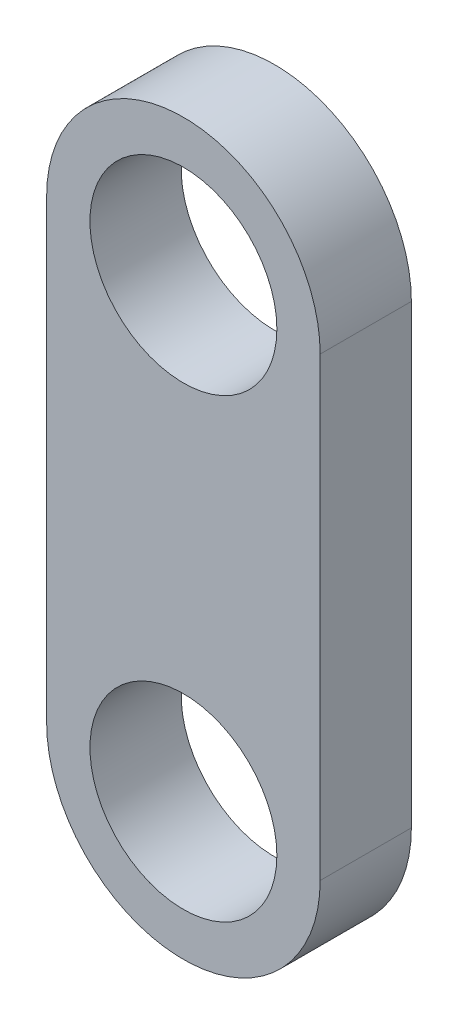
ISO-10303-21;
HEADER;
FILE_DESCRIPTION(('STEP AP214'),'2;1');
FILE_NAME('part.step','',(''),(''),'','','');
FILE_SCHEMA(('AUTOMOTIVE_DESIGN { 1 0 10303 214 1 1 1 1 }'));
ENDSEC;
DATA;
#1=APPLICATION_CONTEXT('core data for automotive mechanical design processes');
#2=APPLICATION_PROTOCOL_DEFINITION('international standard','automotive_design',2000,#1);
#3=PRODUCT_CONTEXT('',#1,'mechanical');
#4=PRODUCT('Part','Part','',(#3));
#5=PRODUCT_RELATED_PRODUCT_CATEGORY('part','',(#4));
#6=PRODUCT_DEFINITION_FORMATION('','',#4);
#7=PRODUCT_DEFINITION_CONTEXT('part definition',#1,'design');
#8=PRODUCT_DEFINITION('design','',#6,#7);
#9=PRODUCT_DEFINITION_SHAPE('','',#8);
#10=(LENGTH_UNIT() NAMED_UNIT(*) SI_UNIT(.MILLI.,.METRE.));
#11=(NAMED_UNIT(*) PLANE_ANGLE_UNIT() SI_UNIT($,.RADIAN.));
#12=(NAMED_UNIT(*) SI_UNIT($,.STERADIAN.) SOLID_ANGLE_UNIT());
#13=UNCERTAINTY_MEASURE_WITH_UNIT(LENGTH_MEASURE(1.E-05),#10,'distance_accuracy_value','');
#14=(GEOMETRIC_REPRESENTATION_CONTEXT(3) GLOBAL_UNCERTAINTY_ASSIGNED_CONTEXT((#13)) GLOBAL_UNIT_ASSIGNED_CONTEXT((#10,
#11,#12)) REPRESENTATION_CONTEXT('',''));
#15=CARTESIAN_POINT('',(0.,0.,0.));
#16=DIRECTION('',(0.,0.,1.));
#17=DIRECTION('',(1.,0.,0.));
#18=AXIS2_PLACEMENT_3D('',#15,#16,#17);
#19=CARTESIAN_POINT('',(-15.,0.,10.));
#20=DIRECTION('',(1.,0.,0.));
#21=DIRECTION('',(0.,1.,0.));
#22=AXIS2_PLACEMENT_3D('',#19,#20,#21);
#23=PLANE('',#22);
#24=DIRECTION('',(0.,-1.,0.));
#25=VECTOR('',#24,1.);
#26=CARTESIAN_POINT('',(-15.,0.,0.));
#27=LINE('',#26,#25);
#28=CARTESIAN_POINT('',(-15.,0.,0.));
#29=VERTEX_POINT('',#28);
#30=CARTESIAN_POINT('',(-15.,-50.,0.));
#31=VERTEX_POINT('',#30);
#32=EDGE_CURVE('E113',#29,#31,#27,.T.);
#33=ORIENTED_EDGE('',*,*,#32,.T.);
#34=DIRECTION('',(0.,0.,-1.));
#35=VECTOR('',#34,1.);
#36=CARTESIAN_POINT('',(-15.,-50.,10.));
#37=LINE('',#36,#35);
#38=CARTESIAN_POINT('',(-15.,-50.,10.));
#39=VERTEX_POINT('',#38);
#40=EDGE_CURVE('E11',#39,#31,#37,.T.);
#41=ORIENTED_EDGE('',*,*,#40,.F.);
#42=DIRECTION('',(0.,-1.,0.));
#43=VECTOR('',#42,1.);
#44=CARTESIAN_POINT('',(-15.,0.,10.));
#45=LINE('',#44,#43);
#46=CARTESIAN_POINT('',(-15.,0.,10.));
#47=VERTEX_POINT('',#46);
#48=EDGE_CURVE('E92',#47,#39,#45,.T.);
#49=ORIENTED_EDGE('',*,*,#48,.F.);
#50=DIRECTION('',(0.,0.,-1.));
#51=VECTOR('',#50,1.);
#52=CARTESIAN_POINT('',(-15.,0.,10.));
#53=LINE('',#52,#51);
#54=EDGE_CURVE('E103',#47,#29,#53,.T.);
#55=ORIENTED_EDGE('',*,*,#54,.T.);
#56=EDGE_LOOP('',(#33,#41,#49,#55));
#57=FACE_BOUND('',#56,.T.);
#58=ADVANCED_FACE('F44',(#57),#23,.F.);
#59=CARTESIAN_POINT('',(0.,-50.,10.));
#60=DIRECTION('',(0.,0.,-1.));
#61=DIRECTION('',(-1.,0.,0.));
#62=AXIS2_PLACEMENT_3D('',#59,#60,#61);
#63=CYLINDRICAL_SURFACE('',#62,15.);
#64=CARTESIAN_POINT('',(0.,-50.,0.));
#65=DIRECTION('',(0.,0.,1.));
#66=DIRECTION('',(1.,0.,0.));
#67=AXIS2_PLACEMENT_3D('',#64,#65,#66);
#68=CIRCLE('',#67,15.);
#69=CARTESIAN_POINT('',(15.,-50.,0.));
#70=VERTEX_POINT('',#69);
#71=EDGE_CURVE('E97',#31,#70,#68,.T.);
#72=ORIENTED_EDGE('',*,*,#71,.T.);
#73=DIRECTION('',(0.,0.,-1.));
#74=VECTOR('',#73,1.);
#75=CARTESIAN_POINT('',(15.,-50.,10.));
#76=LINE('',#75,#74);
#77=CARTESIAN_POINT('',(15.,-50.,10.));
#78=VERTEX_POINT('',#77);
#79=EDGE_CURVE('E53',#78,#70,#76,.T.);
#80=ORIENTED_EDGE('',*,*,#79,.F.);
#81=CARTESIAN_POINT('',(0.,-50.,10.));
#82=DIRECTION('',(0.,0.,1.));
#83=DIRECTION('',(1.,0.,0.));
#84=AXIS2_PLACEMENT_3D('',#81,#82,#83);
#85=CIRCLE('',#84,15.);
#86=EDGE_CURVE('E87',#39,#78,#85,.T.);
#87=ORIENTED_EDGE('',*,*,#86,.F.);
#88=ORIENTED_EDGE('',*,*,#40,.T.);
#89=EDGE_LOOP('',(#72,#80,#87,#88));
#90=FACE_BOUND('',#89,.T.);
#91=ADVANCED_FACE('F96',(#90),#63,.T.);
#92=CARTESIAN_POINT('',(15.,0.,10.));
#93=DIRECTION('',(1.,0.,0.));
#94=DIRECTION('',(0.,1.,0.));
#95=AXIS2_PLACEMENT_3D('',#92,#93,#94);
#96=PLANE('',#95);
#97=DIRECTION('',(0.,-1.,0.));
#98=VECTOR('',#97,1.);
#99=CARTESIAN_POINT('',(15.,0.,0.));
#100=LINE('',#99,#98);
#101=CARTESIAN_POINT('',(15.,0.,0.));
#102=VERTEX_POINT('',#101);
#103=EDGE_CURVE('E117',#102,#70,#100,.T.);
#104=ORIENTED_EDGE('',*,*,#103,.F.);
#105=DIRECTION('',(0.,0.,-1.));
#106=VECTOR('',#105,1.);
#107=CARTESIAN_POINT('',(15.,0.,10.));
#108=LINE('',#107,#106);
#109=CARTESIAN_POINT('',(15.,0.,10.));
#110=VERTEX_POINT('',#109);
#111=EDGE_CURVE('E77',#110,#102,#108,.T.);
#112=ORIENTED_EDGE('',*,*,#111,.F.);
#113=DIRECTION('',(0.,-1.,0.));
#114=VECTOR('',#113,1.);
#115=CARTESIAN_POINT('',(15.,0.,10.));
#116=LINE('',#115,#114);
#117=EDGE_CURVE('E90',#110,#78,#116,.T.);
#118=ORIENTED_EDGE('',*,*,#117,.T.);
#119=ORIENTED_EDGE('',*,*,#79,.T.);
#120=EDGE_LOOP('',(#104,#112,#118,#119));
#121=FACE_BOUND('',#120,.T.);
#122=ADVANCED_FACE('F101',(#121),#96,.T.);
#123=CARTESIAN_POINT('',(0.,0.,10.));
#124=DIRECTION('',(0.,0.,-1.));
#125=DIRECTION('',(-1.,0.,0.));
#126=AXIS2_PLACEMENT_3D('',#123,#124,#125);
#127=CYLINDRICAL_SURFACE('',#126,10.25);
#128=CARTESIAN_POINT('',(0.,0.,10.));
#129=DIRECTION('',(0.,0.,1.));
#130=DIRECTION('',(1.,0.,0.));
#131=AXIS2_PLACEMENT_3D('',#128,#129,#130);
#132=CIRCLE('',#131,10.25);
#133=CARTESIAN_POINT('',(10.25,0.,10.));
#134=VERTEX_POINT('',#133);
#135=EDGE_CURVE('E155',#134,#134,#132,.T.);
#136=ORIENTED_EDGE('',*,*,#135,.T.);
#137=EDGE_LOOP('',(#136));
#138=FACE_BOUND('',#137,.T.);
#139=CARTESIAN_POINT('',(0.,0.,0.));
#140=DIRECTION('',(0.,0.,1.));
#141=DIRECTION('',(1.,0.,0.));
#142=AXIS2_PLACEMENT_3D('',#139,#140,#141);
#143=CIRCLE('',#142,10.25);
#144=CARTESIAN_POINT('',(10.25,0.,0.));
#145=VERTEX_POINT('',#144);
#146=EDGE_CURVE('E110',#145,#145,#143,.T.);
#147=ORIENTED_EDGE('',*,*,#146,.F.);
#148=EDGE_LOOP('',(#147));
#149=FACE_BOUND('',#148,.T.);
#150=ADVANCED_FACE('F144',(#138,#149),#127,.F.);
#151=CARTESIAN_POINT('',(0.,-50.,10.));
#152=DIRECTION('',(0.,0.,-1.));
#153=DIRECTION('',(-1.,0.,0.));
#154=AXIS2_PLACEMENT_3D('',#151,#152,#153);
#155=CYLINDRICAL_SURFACE('',#154,10.25);
#156=CARTESIAN_POINT('',(0.,-50.,10.));
#157=DIRECTION('',(0.,0.,1.));
#158=DIRECTION('',(1.,0.,0.));
#159=AXIS2_PLACEMENT_3D('',#156,#157,#158);
#160=CIRCLE('',#159,10.25);
#161=CARTESIAN_POINT('',(10.25,-50.,10.));
#162=VERTEX_POINT('',#161);
#163=EDGE_CURVE('E120',#162,#162,#160,.T.);
#164=ORIENTED_EDGE('',*,*,#163,.T.);
#165=EDGE_LOOP('',(#164));
#166=FACE_BOUND('',#165,.T.);
#167=CARTESIAN_POINT('',(0.,-50.,0.));
#168=DIRECTION('',(0.,0.,1.));
#169=DIRECTION('',(1.,0.,0.));
#170=AXIS2_PLACEMENT_3D('',#167,#168,#169);
#171=CIRCLE('',#170,10.25);
#172=CARTESIAN_POINT('',(10.25,-50.,0.));
#173=VERTEX_POINT('',#172);
#174=EDGE_CURVE('E107',#173,#173,#171,.T.);
#175=ORIENTED_EDGE('',*,*,#174,.F.);
#176=EDGE_LOOP('',(#175));
#177=FACE_BOUND('',#176,.T.);
#178=ADVANCED_FACE('F46',(#166,#177),#155,.F.);
#179=CARTESIAN_POINT('',(0.,0.,10.));
#180=DIRECTION('',(0.,0.,-1.));
#181=DIRECTION('',(-1.,0.,0.));
#182=AXIS2_PLACEMENT_3D('',#179,#180,#181);
#183=CYLINDRICAL_SURFACE('',#182,15.);
#184=CARTESIAN_POINT('',(0.,0.,0.));
#185=DIRECTION('',(0.,0.,1.));
#186=DIRECTION('',(1.,0.,0.));
#187=AXIS2_PLACEMENT_3D('',#184,#185,#186);
#188=CIRCLE('',#187,15.);
#189=EDGE_CURVE('E80',#102,#29,#188,.T.);
#190=ORIENTED_EDGE('',*,*,#189,.T.);
#191=ORIENTED_EDGE('',*,*,#54,.F.);
#192=CARTESIAN_POINT('',(0.,0.,10.));
#193=DIRECTION('',(0.,0.,1.));
#194=DIRECTION('',(1.,0.,0.));
#195=AXIS2_PLACEMENT_3D('',#192,#193,#194);
#196=CIRCLE('',#195,15.);
#197=EDGE_CURVE('E61',#110,#47,#196,.T.);
#198=ORIENTED_EDGE('',*,*,#197,.F.);
#199=ORIENTED_EDGE('',*,*,#111,.T.);
#200=EDGE_LOOP('',(#190,#191,#198,#199));
#201=FACE_BOUND('',#200,.T.);
#202=ADVANCED_FACE('F132',(#201),#183,.T.);
#203=CARTESIAN_POINT('',(0.,0.,10.));
#204=DIRECTION('',(0.,0.,1.));
#205=DIRECTION('',(1.,0.,0.));
#206=AXIS2_PLACEMENT_3D('',#203,#204,#205);
#207=PLANE('',#206);
#208=ORIENTED_EDGE('',*,*,#163,.F.);
#209=EDGE_LOOP('',(#208));
#210=FACE_BOUND('',#209,.T.);
#211=ORIENTED_EDGE('',*,*,#135,.F.);
#212=EDGE_LOOP('',(#211));
#213=FACE_BOUND('',#212,.T.);
#214=ORIENTED_EDGE('',*,*,#48,.T.);
#215=ORIENTED_EDGE('',*,*,#86,.T.);
#216=ORIENTED_EDGE('',*,*,#117,.F.);
#217=ORIENTED_EDGE('',*,*,#197,.T.);
#218=EDGE_LOOP('',(#214,#215,#216,#217));
#219=FACE_BOUND('',#218,.T.);
#220=ADVANCED_FACE('F88',(#210,#213,#219),#207,.T.);
#221=CARTESIAN_POINT('',(0.,0.,0.));
#222=DIRECTION('',(0.,0.,1.));
#223=DIRECTION('',(1.,0.,0.));
#224=AXIS2_PLACEMENT_3D('',#221,#222,#223);
#225=PLANE('',#224);
#226=ORIENTED_EDGE('',*,*,#174,.T.);
#227=EDGE_LOOP('',(#226));
#228=FACE_BOUND('',#227,.T.);
#229=ORIENTED_EDGE('',*,*,#146,.T.);
#230=EDGE_LOOP('',(#229));
#231=FACE_BOUND('',#230,.T.);
#232=ORIENTED_EDGE('',*,*,#32,.F.);
#233=ORIENTED_EDGE('',*,*,#189,.F.);
#234=ORIENTED_EDGE('',*,*,#103,.T.);
#235=ORIENTED_EDGE('',*,*,#71,.F.);
#236=EDGE_LOOP('',(#232,#233,#234,#235));
#237=FACE_BOUND('',#236,.T.);
#238=ADVANCED_FACE('F125',(#228,#231,#237),#225,.F.);
#239=CLOSED_SHELL('',(#58,#91,#122,#150,#178,#202,#220,#238));
#240=MANIFOLD_SOLID_BREP('B2',#239);
#241=ADVANCED_BREP_SHAPE_REPRESENTATION('',(#18,#240),#14);
#242=SHAPE_DEFINITION_REPRESENTATION(#9,#241);
ENDSEC;
END-ISO-10303-21;
